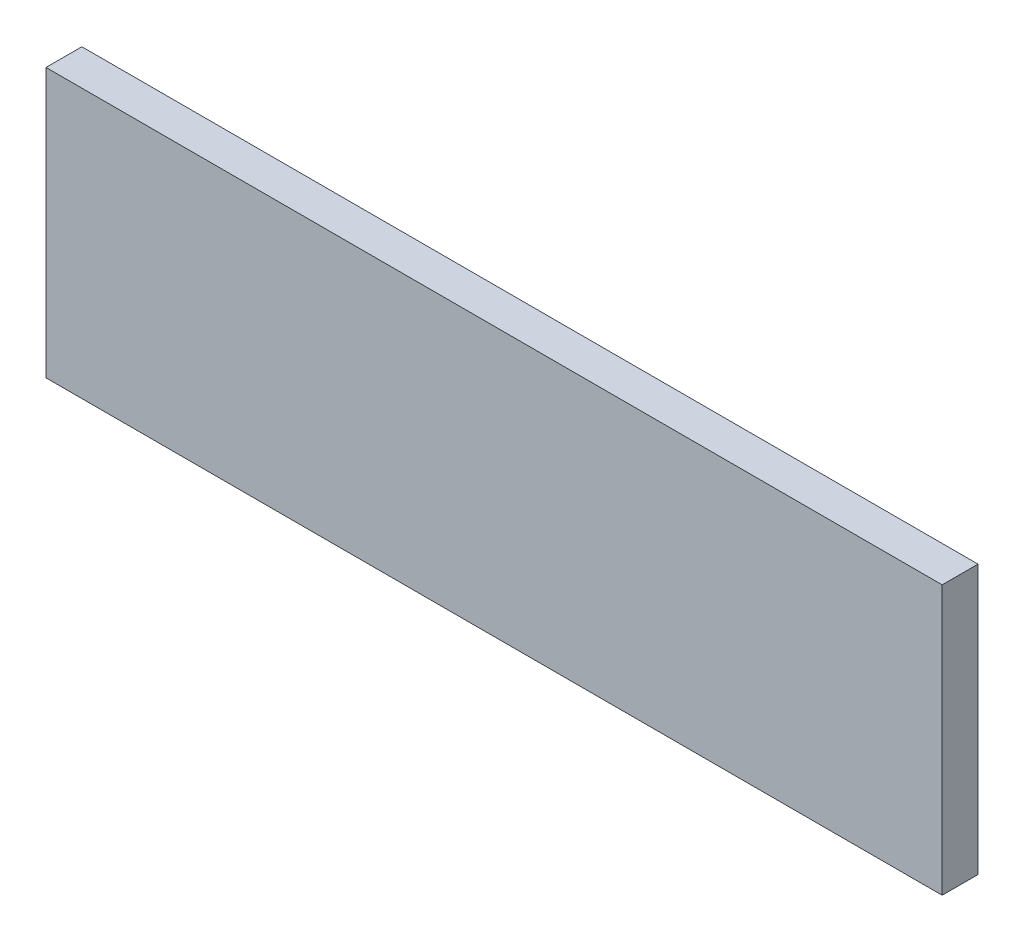
ISO-10303-21;
HEADER;
FILE_DESCRIPTION(('STEP AP214'),'2;1');
FILE_NAME('part.step','',(''),(''),'','','');
FILE_SCHEMA(('AUTOMOTIVE_DESIGN { 1 0 10303 214 1 1 1 1 }'));
ENDSEC;
DATA;
#1=APPLICATION_CONTEXT('core data for automotive mechanical design processes');
#2=APPLICATION_PROTOCOL_DEFINITION('international standard','automotive_design',2000,#1);
#3=PRODUCT_CONTEXT('',#1,'mechanical');
#4=PRODUCT('Part','Part','',(#3));
#5=PRODUCT_RELATED_PRODUCT_CATEGORY('part','',(#4));
#6=PRODUCT_DEFINITION_FORMATION('','',#4);
#7=PRODUCT_DEFINITION_CONTEXT('part definition',#1,'design');
#8=PRODUCT_DEFINITION('design','',#6,#7);
#9=PRODUCT_DEFINITION_SHAPE('','',#8);
#10=(LENGTH_UNIT() NAMED_UNIT(*) SI_UNIT(.MILLI.,.METRE.));
#11=(NAMED_UNIT(*) PLANE_ANGLE_UNIT() SI_UNIT($,.RADIAN.));
#12=(NAMED_UNIT(*) SI_UNIT($,.STERADIAN.) SOLID_ANGLE_UNIT());
#13=UNCERTAINTY_MEASURE_WITH_UNIT(LENGTH_MEASURE(1.E-05),#10,'distance_accuracy_value','');
#14=(GEOMETRIC_REPRESENTATION_CONTEXT(3) GLOBAL_UNCERTAINTY_ASSIGNED_CONTEXT((#13)) GLOBAL_UNIT_ASSIGNED_CONTEXT((#10,
#11,#12)) REPRESENTATION_CONTEXT('',''));
#15=CARTESIAN_POINT('',(0.,0.,0.));
#16=DIRECTION('',(0.,0.,1.));
#17=DIRECTION('',(1.,0.,0.));
#18=AXIS2_PLACEMENT_3D('',#15,#16,#17);
#19=CARTESIAN_POINT('',(125.,37.5,10.));
#20=DIRECTION('',(-1.,0.,0.));
#21=DIRECTION('',(0.,-1.,0.));
#22=AXIS2_PLACEMENT_3D('',#19,#20,#21);
#23=PLANE('',#22);
#24=DIRECTION('',(0.,1.,0.));
#25=VECTOR('',#24,1.);
#26=CARTESIAN_POINT('',(125.,37.5,0.));
#27=LINE('',#26,#25);
#28=CARTESIAN_POINT('',(125.,-37.5,0.));
#29=VERTEX_POINT('',#28);
#30=CARTESIAN_POINT('',(125.,37.5,0.));
#31=VERTEX_POINT('',#30);
#32=EDGE_CURVE('E102',#29,#31,#27,.T.);
#33=ORIENTED_EDGE('',*,*,#32,.T.);
#34=DIRECTION('',(0.,0.,-1.));
#35=VECTOR('',#34,1.);
#36=CARTESIAN_POINT('',(125.,37.5,10.));
#37=LINE('',#36,#35);
#38=CARTESIAN_POINT('',(125.,37.5,10.));
#39=VERTEX_POINT('',#38);
#40=EDGE_CURVE('E11',#39,#31,#37,.T.);
#41=ORIENTED_EDGE('',*,*,#40,.F.);
#42=DIRECTION('',(0.,1.,0.));
#43=VECTOR('',#42,1.);
#44=CARTESIAN_POINT('',(125.,37.5,10.));
#45=LINE('',#44,#43);
#46=CARTESIAN_POINT('',(125.,-37.5,10.));
#47=VERTEX_POINT('',#46);
#48=EDGE_CURVE('E90',#47,#39,#45,.T.);
#49=ORIENTED_EDGE('',*,*,#48,.F.);
#50=DIRECTION('',(0.,0.,-1.));
#51=VECTOR('',#50,1.);
#52=CARTESIAN_POINT('',(125.,-37.5,10.));
#53=LINE('',#52,#51);
#54=EDGE_CURVE('E98',#47,#29,#53,.T.);
#55=ORIENTED_EDGE('',*,*,#54,.T.);
#56=EDGE_LOOP('',(#33,#41,#49,#55));
#57=FACE_BOUND('',#56,.T.);
#58=ADVANCED_FACE('F39',(#57),#23,.F.);
#59=CARTESIAN_POINT('',(-125.,37.5,10.));
#60=DIRECTION('',(0.,-1.,0.));
#61=DIRECTION('',(0.,0.,-1.));
#62=AXIS2_PLACEMENT_3D('',#59,#60,#61);
#63=PLANE('',#62);
#64=DIRECTION('',(-1.,0.,0.));
#65=VECTOR('',#64,1.);
#66=CARTESIAN_POINT('',(-125.,37.5,0.));
#67=LINE('',#66,#65);
#68=CARTESIAN_POINT('',(-125.,37.5,0.));
#69=VERTEX_POINT('',#68);
#70=EDGE_CURVE('E94',#31,#69,#67,.T.);
#71=ORIENTED_EDGE('',*,*,#70,.T.);
#72=DIRECTION('',(0.,0.,-1.));
#73=VECTOR('',#72,1.);
#74=CARTESIAN_POINT('',(-125.,37.5,10.));
#75=LINE('',#74,#73);
#76=CARTESIAN_POINT('',(-125.,37.5,10.));
#77=VERTEX_POINT('',#76);
#78=EDGE_CURVE('E47',#77,#69,#75,.T.);
#79=ORIENTED_EDGE('',*,*,#78,.F.);
#80=DIRECTION('',(-1.,0.,0.));
#81=VECTOR('',#80,1.);
#82=CARTESIAN_POINT('',(-125.,37.5,10.));
#83=LINE('',#82,#81);
#84=EDGE_CURVE('E85',#39,#77,#83,.T.);
#85=ORIENTED_EDGE('',*,*,#84,.F.);
#86=ORIENTED_EDGE('',*,*,#40,.T.);
#87=EDGE_LOOP('',(#71,#79,#85,#86));
#88=FACE_BOUND('',#87,.T.);
#89=ADVANCED_FACE('F93',(#88),#63,.F.);
#90=CARTESIAN_POINT('',(-125.,37.5,10.));
#91=DIRECTION('',(1.,0.,0.));
#92=DIRECTION('',(0.,0.,-1.));
#93=AXIS2_PLACEMENT_3D('',#90,#91,#92);
#94=PLANE('',#93);
#95=DIRECTION('',(0.,-1.,0.));
#96=VECTOR('',#95,1.);
#97=CARTESIAN_POINT('',(-125.,37.5,0.));
#98=LINE('',#97,#96);
#99=CARTESIAN_POINT('',(-125.,-37.5,0.));
#100=VERTEX_POINT('',#99);
#101=EDGE_CURVE('E72',#69,#100,#98,.T.);
#102=ORIENTED_EDGE('',*,*,#101,.T.);
#103=DIRECTION('',(0.,0.,-1.));
#104=VECTOR('',#103,1.);
#105=CARTESIAN_POINT('',(-125.,-37.5,10.));
#106=LINE('',#105,#104);
#107=CARTESIAN_POINT('',(-125.,-37.5,10.));
#108=VERTEX_POINT('',#107);
#109=EDGE_CURVE('E95',#108,#100,#106,.T.);
#110=ORIENTED_EDGE('',*,*,#109,.F.);
#111=DIRECTION('',(0.,-1.,0.));
#112=VECTOR('',#111,1.);
#113=CARTESIAN_POINT('',(-125.,37.5,10.));
#114=LINE('',#113,#112);
#115=EDGE_CURVE('E88',#77,#108,#114,.T.);
#116=ORIENTED_EDGE('',*,*,#115,.F.);
#117=ORIENTED_EDGE('',*,*,#78,.T.);
#118=EDGE_LOOP('',(#102,#110,#116,#117));
#119=FACE_BOUND('',#118,.T.);
#120=ADVANCED_FACE('F96',(#119),#94,.F.);
#121=CARTESIAN_POINT('',(-125.,-37.5,10.));
#122=DIRECTION('',(0.,1.,0.));
#123=DIRECTION('',(0.,0.,1.));
#124=AXIS2_PLACEMENT_3D('',#121,#122,#123);
#125=PLANE('',#124);
#126=DIRECTION('',(1.,0.,0.));
#127=VECTOR('',#126,1.);
#128=CARTESIAN_POINT('',(-125.,-37.5,0.));
#129=LINE('',#128,#127);
#130=EDGE_CURVE('E78',#100,#29,#129,.T.);
#131=ORIENTED_EDGE('',*,*,#130,.T.);
#132=ORIENTED_EDGE('',*,*,#54,.F.);
#133=DIRECTION('',(1.,0.,0.));
#134=VECTOR('',#133,1.);
#135=CARTESIAN_POINT('',(-125.,-37.5,10.));
#136=LINE('',#135,#134);
#137=EDGE_CURVE('E55',#108,#47,#136,.T.);
#138=ORIENTED_EDGE('',*,*,#137,.F.);
#139=ORIENTED_EDGE('',*,*,#109,.T.);
#140=EDGE_LOOP('',(#131,#132,#138,#139));
#141=FACE_BOUND('',#140,.T.);
#142=ADVANCED_FACE('F109',(#141),#125,.F.);
#143=CARTESIAN_POINT('',(0.,0.,10.));
#144=DIRECTION('',(0.,0.,1.));
#145=DIRECTION('',(1.,0.,0.));
#146=AXIS2_PLACEMENT_3D('',#143,#144,#145);
#147=PLANE('',#146);
#148=ORIENTED_EDGE('',*,*,#48,.T.);
#149=ORIENTED_EDGE('',*,*,#84,.T.);
#150=ORIENTED_EDGE('',*,*,#115,.T.);
#151=ORIENTED_EDGE('',*,*,#137,.T.);
#152=EDGE_LOOP('',(#148,#149,#150,#151));
#153=FACE_BOUND('',#152,.T.);
#154=ADVANCED_FACE('F86',(#153),#147,.T.);
#155=CARTESIAN_POINT('',(0.,0.,0.));
#156=DIRECTION('',(0.,0.,1.));
#157=DIRECTION('',(1.,0.,0.));
#158=AXIS2_PLACEMENT_3D('',#155,#156,#157);
#159=PLANE('',#158);
#160=ORIENTED_EDGE('',*,*,#32,.F.);
#161=ORIENTED_EDGE('',*,*,#130,.F.);
#162=ORIENTED_EDGE('',*,*,#101,.F.);
#163=ORIENTED_EDGE('',*,*,#70,.F.);
#164=EDGE_LOOP('',(#160,#161,#162,#163));
#165=FACE_BOUND('',#164,.T.);
#166=ADVANCED_FACE('F112',(#165),#159,.F.);
#167=CLOSED_SHELL('',(#58,#89,#120,#142,#154,#166));
#168=MANIFOLD_SOLID_BREP('B2',#167);
#169=ADVANCED_BREP_SHAPE_REPRESENTATION('',(#18,#168),#14);
#170=SHAPE_DEFINITION_REPRESENTATION(#9,#169);
ENDSEC;
END-ISO-10303-21;
